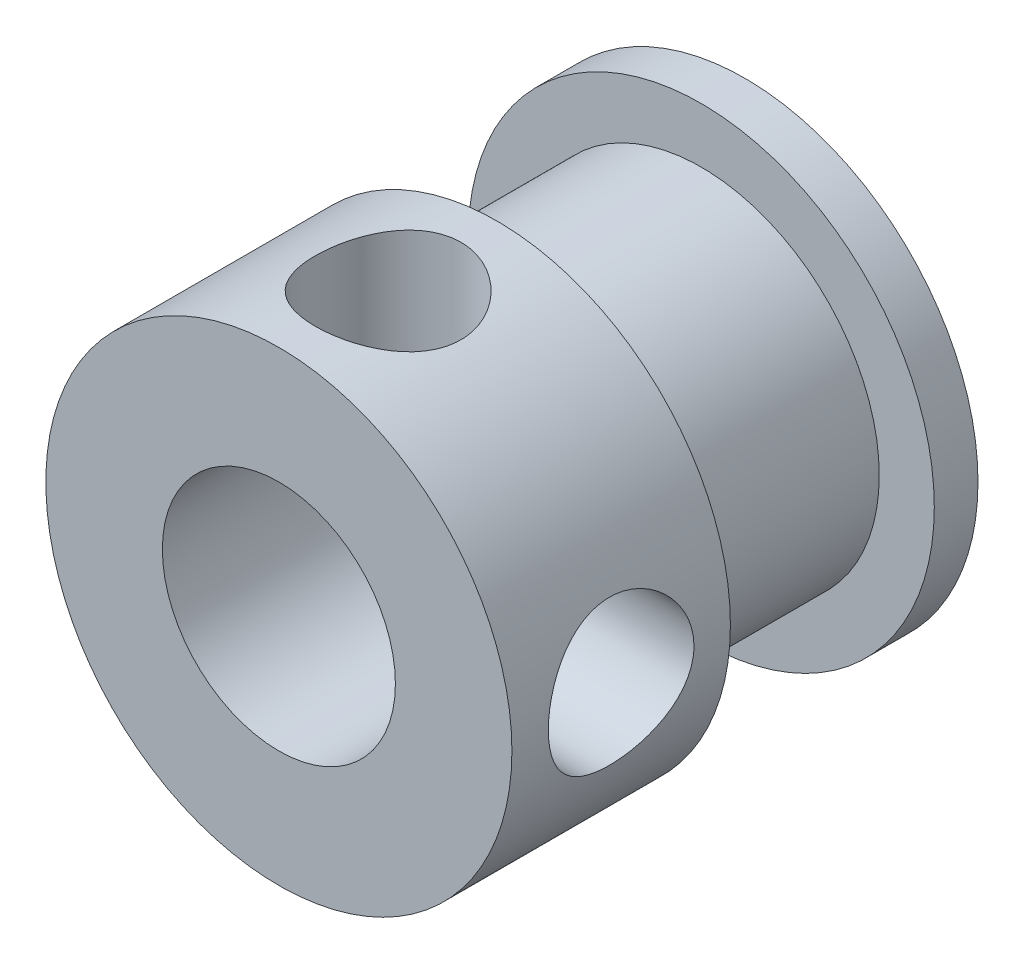
ISO-10303-21;
HEADER;
FILE_DESCRIPTION(('STEP AP214'),'2;1');
FILE_NAME('part.step','',(''),(''),'','','');
FILE_SCHEMA(('AUTOMOTIVE_DESIGN { 1 0 10303 214 1 1 1 1 }'));
ENDSEC;
DATA;
#1=APPLICATION_CONTEXT('core data for automotive mechanical design processes');
#2=APPLICATION_PROTOCOL_DEFINITION('international standard','automotive_design',2000,#1);
#3=PRODUCT_CONTEXT('',#1,'mechanical');
#4=PRODUCT('Part','Part','',(#3));
#5=PRODUCT_RELATED_PRODUCT_CATEGORY('part','',(#4));
#6=PRODUCT_DEFINITION_FORMATION('','',#4);
#7=PRODUCT_DEFINITION_CONTEXT('part definition',#1,'design');
#8=PRODUCT_DEFINITION('design','',#6,#7);
#9=PRODUCT_DEFINITION_SHAPE('','',#8);
#10=(LENGTH_UNIT() NAMED_UNIT(*) SI_UNIT(.MILLI.,.METRE.));
#11=(NAMED_UNIT(*) PLANE_ANGLE_UNIT() SI_UNIT($,.RADIAN.));
#12=(NAMED_UNIT(*) SI_UNIT($,.STERADIAN.) SOLID_ANGLE_UNIT());
#13=UNCERTAINTY_MEASURE_WITH_UNIT(LENGTH_MEASURE(1.E-05),#10,'distance_accuracy_value','');
#14=(GEOMETRIC_REPRESENTATION_CONTEXT(3) GLOBAL_UNCERTAINTY_ASSIGNED_CONTEXT((#13)) GLOBAL_UNIT_ASSIGNED_CONTEXT((#10,
#11,#12)) REPRESENTATION_CONTEXT('',''));
#15=CARTESIAN_POINT('',(0.,0.,0.));
#16=DIRECTION('',(0.,0.,1.));
#17=DIRECTION('',(1.,0.,0.));
#18=AXIS2_PLACEMENT_3D('',#15,#16,#17);
#19=CARTESIAN_POINT('',(0.,0.,1.5));
#20=DIRECTION('',(0.,0.,-1.));
#21=DIRECTION('',(-1.,0.,0.));
#22=AXIS2_PLACEMENT_3D('',#19,#20,#21);
#23=CYLINDRICAL_SURFACE('',#22,8.);
#24=CARTESIAN_POINT('',(0.,0.,1.5));
#25=DIRECTION('',(0.,0.,1.));
#26=DIRECTION('',(1.,0.,0.));
#27=AXIS2_PLACEMENT_3D('',#24,#25,#26);
#28=CIRCLE('',#27,8.);
#29=CARTESIAN_POINT('',(8.,0.,1.5));
#30=VERTEX_POINT('',#29);
#31=EDGE_CURVE('E44',#30,#30,#28,.T.);
#32=ORIENTED_EDGE('',*,*,#31,.F.);
#33=EDGE_LOOP('',(#32));
#34=FACE_BOUND('',#33,.T.);
#35=CARTESIAN_POINT('',(0.,0.,0.));
#36=DIRECTION('',(0.,0.,1.));
#37=DIRECTION('',(1.,0.,0.));
#38=AXIS2_PLACEMENT_3D('',#35,#36,#37);
#39=CIRCLE('',#38,8.);
#40=CARTESIAN_POINT('',(8.,0.,0.));
#41=VERTEX_POINT('',#40);
#42=EDGE_CURVE('E49',#41,#41,#39,.T.);
#43=ORIENTED_EDGE('',*,*,#42,.T.);
#44=EDGE_LOOP('',(#43));
#45=FACE_BOUND('',#44,.T.);
#46=ADVANCED_FACE('F32',(#34,#45),#23,.T.);
#47=CARTESIAN_POINT('',(0.,0.,1.5));
#48=DIRECTION('',(0.,0.,1.));
#49=DIRECTION('',(1.,0.,0.));
#50=AXIS2_PLACEMENT_3D('',#47,#48,#49);
#51=PLANE('',#50);
#52=CARTESIAN_POINT('',(0.,0.,1.5));
#53=DIRECTION('',(0.,0.,1.));
#54=DIRECTION('',(1.,0.,0.));
#55=AXIS2_PLACEMENT_3D('',#52,#53,#54);
#56=CIRCLE('',#55,6.11);
#57=CARTESIAN_POINT('',(6.11,0.,1.5));
#58=VERTEX_POINT('',#57);
#59=EDGE_CURVE('E10',#58,#58,#56,.T.);
#60=ORIENTED_EDGE('',*,*,#59,.F.);
#61=EDGE_LOOP('',(#60));
#62=FACE_BOUND('',#61,.T.);
#63=ORIENTED_EDGE('',*,*,#31,.T.);
#64=EDGE_LOOP('',(#63));
#65=FACE_BOUND('',#64,.T.);
#66=ADVANCED_FACE('F115',(#62,#65),#51,.T.);
#67=CARTESIAN_POINT('',(0.,0.,0.));
#68=DIRECTION('',(0.,0.,1.));
#69=DIRECTION('',(1.,0.,0.));
#70=AXIS2_PLACEMENT_3D('',#67,#68,#69);
#71=PLANE('',#70);
#72=CARTESIAN_POINT('',(0.,0.,0.));
#73=DIRECTION('',(0.,0.,1.));
#74=DIRECTION('',(1.,0.,0.));
#75=AXIS2_PLACEMENT_3D('',#72,#73,#74);
#76=CIRCLE('',#75,4.);
#77=CARTESIAN_POINT('',(4.,0.,0.));
#78=VERTEX_POINT('',#77);
#79=EDGE_CURVE('E90',#78,#78,#76,.F.);
#80=ORIENTED_EDGE('',*,*,#79,.F.);
#81=EDGE_LOOP('',(#80));
#82=FACE_BOUND('',#81,.T.);
#83=ORIENTED_EDGE('',*,*,#42,.F.);
#84=EDGE_LOOP('',(#83));
#85=FACE_BOUND('',#84,.T.);
#86=ADVANCED_FACE('F120',(#82,#85),#71,.F.);
#87=CARTESIAN_POINT('',(0.,0.,8.5));
#88=DIRECTION('',(0.,0.,-1.));
#89=DIRECTION('',(-1.,0.,0.));
#90=AXIS2_PLACEMENT_3D('',#87,#88,#89);
#91=CYLINDRICAL_SURFACE('',#90,6.11);
#92=CARTESIAN_POINT('',(0.,0.,8.5));
#93=DIRECTION('',(0.,0.,1.));
#94=DIRECTION('',(1.,0.,0.));
#95=AXIS2_PLACEMENT_3D('',#92,#93,#94);
#96=CIRCLE('',#95,6.11);
#97=CARTESIAN_POINT('',(6.11,0.,8.5));
#98=VERTEX_POINT('',#97);
#99=EDGE_CURVE('E52',#98,#98,#96,.T.);
#100=ORIENTED_EDGE('',*,*,#99,.F.);
#101=EDGE_LOOP('',(#100));
#102=FACE_BOUND('',#101,.T.);
#103=ORIENTED_EDGE('',*,*,#59,.T.);
#104=EDGE_LOOP('',(#103));
#105=FACE_BOUND('',#104,.T.);
#106=ADVANCED_FACE('F128',(#102,#105),#91,.T.);
#107=CARTESIAN_POINT('',(0.,0.,16.));
#108=DIRECTION('',(0.,0.,-1.));
#109=DIRECTION('',(-1.,0.,0.));
#110=AXIS2_PLACEMENT_3D('',#107,#108,#109);
#111=CYLINDRICAL_SURFACE('',#110,8.);
#112=CARTESIAN_POINT('',(0.,8.,9.75));
#113=CARTESIAN_POINT('',(-0.136878370349093,7.9999993175598,9.75000089317516));
#114=CARTESIAN_POINT('',(-0.273766105005718,7.99645389969682,9.76127845388891));
#115=CARTESIAN_POINT('',(-0.543538419176896,7.98265788177613,9.80597248307847));
#116=CARTESIAN_POINT('',(-0.676422085451814,7.97240576399719,9.83939396272872));
#117=CARTESIAN_POINT('',(-0.934257087301612,7.94631631395819,9.92713874239148));
#118=CARTESIAN_POINT('',(-1.05922035397161,7.9304876299805,9.98142968930593));
#119=CARTESIAN_POINT('',(-1.29826960469292,7.89487938322185,10.1092346353567));
#120=CARTESIAN_POINT('',(-1.41235387088977,7.8750991979981,10.1827516635612));
#121=CARTESIAN_POINT('',(-1.62993066990456,7.83300427480565,10.3493119840347));
#122=CARTESIAN_POINT('',(-1.73304005631332,7.81063431853978,10.4428417701221));
#123=CARTESIAN_POINT('',(-1.92239476407399,7.76620092748417,10.6457367848271));
#124=CARTESIAN_POINT('',(-2.00863694579739,7.74413755046914,10.7551049549891));
#125=CARTESIAN_POINT('',(-2.16388672966227,7.70222289396344,10.9898891276162));
#126=CARTESIAN_POINT('',(-2.23241568300257,7.68243976603591,11.1156349550544));
#127=CARTESIAN_POINT('',(-2.34719482153343,7.64815603598469,11.3775846299637));
#128=CARTESIAN_POINT('',(-2.39345087543889,7.63365404257377,11.5137857115879));
#129=CARTESIAN_POINT('',(-2.46096919860067,7.61215213969002,11.7884561549041));
#130=CARTESIAN_POINT('',(-2.48294220015729,7.60493945859017,11.9267336872777));
#131=CARTESIAN_POINT('',(-2.50349110073976,7.59820110281901,12.2051862378238));
#132=CARTESIAN_POINT('',(-2.50207321991544,7.59867338454669,12.3453607416433));
#133=CARTESIAN_POINT('',(-2.47643649465478,7.60706378150876,12.617748920538));
#134=CARTESIAN_POINT('',(-2.45312115738766,7.61468683491897,12.7500582517231));
#135=CARTESIAN_POINT('',(-2.38581626711252,7.63604051304978,13.0087843130747));
#136=CARTESIAN_POINT('',(-2.34182451689101,7.6497717868623,13.1352004154176));
#137=CARTESIAN_POINT('',(-2.23377749362554,7.68202088028593,13.3807038888653));
#138=CARTESIAN_POINT('',(-2.16943851324163,7.70060569321649,13.499657221384));
#139=CARTESIAN_POINT('',(-2.02272041475696,7.7404371316014,13.7253755357582));
#140=CARTESIAN_POINT('',(-1.94033661043154,7.76168444789102,13.8321373405074));
#141=CARTESIAN_POINT('',(-1.75543390836425,7.80563055600986,14.035549886834));
#142=CARTESIAN_POINT('',(-1.65216914118563,7.82835139211391,14.1315191155594));
#143=CARTESIAN_POINT('',(-1.43072881619106,7.8718314151916,14.3049437871594));
#144=CARTESIAN_POINT('',(-1.31255215469804,7.89259045676745,14.3823978584384));
#145=CARTESIAN_POINT('',(-1.06332922093091,7.93002589780382,14.5170553772025));
#146=CARTESIAN_POINT('',(-0.932189813838559,7.94666921296415,14.5740962709279));
#147=CARTESIAN_POINT('',(-0.661535955565289,7.97375911657108,14.6651060017031));
#148=CARTESIAN_POINT('',(-0.522024061449216,7.98420758650304,14.6990818444768));
#149=CARTESIAN_POINT('',(-0.244370314580689,7.99742778790027,14.741836085158));
#150=CARTESIAN_POINT('',(-0.106383697577686,8.00048045790873,14.751537087187));
#151=CARTESIAN_POINT('',(0.169260611465172,7.99939599461967,14.7480675467253));
#152=CARTESIAN_POINT('',(0.306918348613018,7.9952599116227,14.7349003453548));
#153=CARTESIAN_POINT('',(0.574438665951697,7.98044727539523,14.6868088147872));
#154=CARTESIAN_POINT('',(0.704409956841872,7.96993586221374,14.652433464775));
#155=CARTESIAN_POINT('',(0.956703857722752,7.94360242758579,14.5635712952666));
#156=CARTESIAN_POINT('',(1.07902552089812,7.92777975028687,14.50908199195));
#157=CARTESIAN_POINT('',(1.31586481334437,7.89197085518848,14.3800535669026));
#158=CARTESIAN_POINT('',(1.43011947957558,7.87189253635335,14.3050580250064));
#159=CARTESIAN_POINT('',(1.64473170192052,7.82986820006859,14.1376935797652));
#160=CARTESIAN_POINT('',(1.7450854760879,7.80792167695774,14.0453199645107));
#161=CARTESIAN_POINT('',(1.93317492583804,7.76353989766283,13.8414822198958));
#162=CARTESIAN_POINT('',(2.02025304679062,7.74111973412883,13.7294066725216));
#163=CARTESIAN_POINT('',(2.17442500490303,7.69923894191212,13.4917467672465));
#164=CARTESIAN_POINT('',(2.24151915946859,7.67977826622621,13.366162623946));
#165=CARTESIAN_POINT('',(2.35340166961084,7.64623564661738,13.105309654259));
#166=CARTESIAN_POINT('',(2.39827639112025,7.63213292713749,12.9700807011286));
#167=CARTESIAN_POINT('',(2.4644578863618,7.6110234168862,12.6934550135028));
#168=CARTESIAN_POINT('',(2.48577362827989,7.60401392602456,12.5520606473129));
#169=CARTESIAN_POINT('',(2.50358812316251,7.59816585427753,12.2739918248391));
#170=CARTESIAN_POINT('',(2.50116559243271,7.59897209200283,12.1373930923052));
#171=CARTESIAN_POINT('',(2.47417636257668,7.60780180751807,11.8666508301161));
#172=CARTESIAN_POINT('',(2.44961069645024,7.61582494863208,11.7325071862265));
#173=CARTESIAN_POINT('',(2.37975459827235,7.6379362836678,11.4724119208162));
#174=CARTESIAN_POINT('',(2.33477284812016,7.65193396380514,11.3463691178133));
#175=CARTESIAN_POINT('',(2.22560454669999,7.68439408509128,11.103519172932));
#176=CARTESIAN_POINT('',(2.16141408888473,7.70285743429343,10.9867139158432));
#177=CARTESIAN_POINT('',(2.01271350026986,7.74306974067005,10.7607080591204));
#178=CARTESIAN_POINT('',(1.92750667048264,7.76491897845914,10.6519837409995));
#179=CARTESIAN_POINT('',(1.7404179928096,7.8089799764242,10.450027343776));
#180=CARTESIAN_POINT('',(1.63853168468878,7.83119183213309,10.3567994220179));
#181=CARTESIAN_POINT('',(1.41697332564669,7.87434543904947,10.1854349232741));
#182=CARTESIAN_POINT('',(1.29682914897477,7.89522203461345,10.1078905271001));
#183=CARTESIAN_POINT('',(1.0445582760273,7.93253538593756,9.97420216972109));
#184=CARTESIAN_POINT('',(0.912436315590897,7.94897388631644,9.91804979571633));
#185=CARTESIAN_POINT('',(0.651495270747957,7.97441301466941,9.83281726478307));
#186=CARTESIAN_POINT('',(0.523340674225093,7.98392481612283,9.80185026538933));
#187=CARTESIAN_POINT('',(0.263459790880496,7.99671800680967,9.76044328006457));
#188=CARTESIAN_POINT('',(0.13173423227935,8.00000065679286,9.749999140392));
#189=CARTESIAN_POINT('',(0.,8.,9.75));
#190=B_SPLINE_CURVE_WITH_KNOTS('',3,(#112,#113,#114,#115,#116,#117,#118,#119,#120,#121,#122,
#123,#124,#125,#126,#127,#128,#129,#130,#131,#132,#133,#134,#135,#136,#137,#138,#139,#140,#141,
#142,#143,#144,#145,#146,#147,#148,#149,#150,#151,#152,#153,#154,#155,#156,#157,#158,#159,#160,
#161,#162,#163,#164,#165,#166,#167,#168,#169,#170,#171,#172,#173,#174,#175,#176,#177,#178,#179,
#180,#181,#182,#183,#184,#185,#186,#187,#188,#189),.UNSPECIFIED.,.T.,.F.,(4,2,2,2,2,2,2,2,2,2,2,
2,2,2,2,2,2,2,2,2,2,2,2,2,2,2,2,2,2,2,2,2,2,2,2,2,2,2,4),(0.,0.410150898865019,
0.820394646698132,1.23000495840487,1.63967984311678,2.06075644390316,2.48191134862552,
2.91347542494988,3.34492572559054,3.7633830033442,4.18172900590276,4.58353834844338,
4.98539039958125,5.3931128544109,5.80094132020717,6.227334945592,6.65376014826606,
7.0835092137954,7.51312768989108,7.92615137096475,8.33911471298725,8.74181253445744,
9.14456010068999,9.55712649476686,9.96980491418518,10.3988355742628,10.8278594196742,
11.2552023150671,11.6823824779468,12.0902440696666,12.4980866352126,12.8999582681244,
13.3019116867944,13.7195902803182,14.1373807476578,14.5688133627192,15.0000761335177,
15.3948927332218,15.7896294154519),.UNSPECIFIED.);
#191=CARTESIAN_POINT('',(0.,8.,9.75));
#192=VERTEX_POINT('',#191);
#193=EDGE_CURVE('E84',#192,#192,#190,.T.);
#194=ORIENTED_EDGE('',*,*,#193,.F.);
#195=EDGE_LOOP('',(#194));
#196=FACE_BOUND('',#195,.T.);
#197=CARTESIAN_POINT('',(8.,0.,14.75));
#198=CARTESIAN_POINT('',(7.9999993175598,-0.136878370349093,14.7499991068248));
#199=CARTESIAN_POINT('',(7.99645389969682,-0.273766105005718,14.7387215461111));
#200=CARTESIAN_POINT('',(7.98265788177613,-0.543538419176896,14.6940275169215));
#201=CARTESIAN_POINT('',(7.97240576399719,-0.676422085451814,14.6606060372713));
#202=CARTESIAN_POINT('',(7.94631631395819,-0.934257087301612,14.5728612576085));
#203=CARTESIAN_POINT('',(7.9304876299805,-1.05922035397161,14.5185703106941));
#204=CARTESIAN_POINT('',(7.89487938322185,-1.29826960469292,14.3907653646433));
#205=CARTESIAN_POINT('',(7.8750991979981,-1.41235387088977,14.3172483364388));
#206=CARTESIAN_POINT('',(7.83300427480565,-1.62993066990456,14.1506880159653));
#207=CARTESIAN_POINT('',(7.81063431853978,-1.73304005631332,14.0571582298779));
#208=CARTESIAN_POINT('',(7.76620092748417,-1.92239476407399,13.8542632151729));
#209=CARTESIAN_POINT('',(7.74413755046914,-2.00863694579739,13.7448950450109));
#210=CARTESIAN_POINT('',(7.70222289396344,-2.16388672966227,13.5101108723838));
#211=CARTESIAN_POINT('',(7.68243976603591,-2.23241568300257,13.3843650449456));
#212=CARTESIAN_POINT('',(7.64815603598469,-2.34719482153343,13.1224153700363));
#213=CARTESIAN_POINT('',(7.63365404257377,-2.39345087543889,12.9862142884121));
#214=CARTESIAN_POINT('',(7.61215213969002,-2.46096919860067,12.7115438450959));
#215=CARTESIAN_POINT('',(7.60493945859017,-2.48294220015729,12.5732663127223));
#216=CARTESIAN_POINT('',(7.59820110281901,-2.50349110073976,12.2948137621762));
#217=CARTESIAN_POINT('',(7.59867338454669,-2.50207321991544,12.1546392583567));
#218=CARTESIAN_POINT('',(7.60706378150876,-2.47643649465478,11.882251079462));
#219=CARTESIAN_POINT('',(7.61468683491897,-2.45312115738766,11.7499417482769));
#220=CARTESIAN_POINT('',(7.63604051304978,-2.38581626711252,11.4912156869253));
#221=CARTESIAN_POINT('',(7.6497717868623,-2.34182451689101,11.3647995845824));
#222=CARTESIAN_POINT('',(7.68202088028593,-2.23377749362554,11.1192961111347));
#223=CARTESIAN_POINT('',(7.70060569321649,-2.16943851324163,11.000342778616));
#224=CARTESIAN_POINT('',(7.7404371316014,-2.02272041475696,10.7746244642418));
#225=CARTESIAN_POINT('',(7.76168444789102,-1.94033661043154,10.6678626594926));
#226=CARTESIAN_POINT('',(7.80563055600986,-1.75543390836425,10.464450113166));
#227=CARTESIAN_POINT('',(7.82835139211391,-1.65216914118563,10.3684808844406));
#228=CARTESIAN_POINT('',(7.8718314151916,-1.43072881619106,10.1950562128406));
#229=CARTESIAN_POINT('',(7.89259045676745,-1.31255215469804,10.1176021415616));
#230=CARTESIAN_POINT('',(7.93002589780382,-1.06332922093091,9.98294462279745));
#231=CARTESIAN_POINT('',(7.94666921296415,-0.932189813838559,9.92590372907206));
#232=CARTESIAN_POINT('',(7.97375911657108,-0.661535955565288,9.83489399829687));
#233=CARTESIAN_POINT('',(7.98420758650304,-0.522024061449216,9.80091815552321));
#234=CARTESIAN_POINT('',(7.99742778790027,-0.244370314580689,9.75816391484204));
#235=CARTESIAN_POINT('',(8.00048045790873,-0.106383697577686,9.74846291281295));
#236=CARTESIAN_POINT('',(7.99939599461967,0.169260611465172,9.75193245327466));
#237=CARTESIAN_POINT('',(7.9952599116227,0.306918348613018,9.76509965464522));
#238=CARTESIAN_POINT('',(7.98044727539523,0.574438665951697,9.81319118521277));
#239=CARTESIAN_POINT('',(7.96993586221374,0.704409956841873,9.84756653522498));
#240=CARTESIAN_POINT('',(7.94360242758579,0.956703857722753,9.93642870473343));
#241=CARTESIAN_POINT('',(7.92777975028687,1.07902552089812,9.99091800805003));
#242=CARTESIAN_POINT('',(7.89197085518848,1.31586481334438,10.1199464330974));
#243=CARTESIAN_POINT('',(7.87189253635335,1.43011947957558,10.1949419749936));
#244=CARTESIAN_POINT('',(7.82986820006859,1.64473170192052,10.3623064202348));
#245=CARTESIAN_POINT('',(7.80792167695774,1.7450854760879,10.4546800354893));
#246=CARTESIAN_POINT('',(7.76353989766283,1.93317492583804,10.6585177801042));
#247=CARTESIAN_POINT('',(7.74111973412883,2.02025304679062,10.7705933274784));
#248=CARTESIAN_POINT('',(7.69923894191212,2.17442500490303,11.0082532327535));
#249=CARTESIAN_POINT('',(7.67977826622621,2.24151915946859,11.133837376054));
#250=CARTESIAN_POINT('',(7.64623564661738,2.35340166961084,11.394690345741));
#251=CARTESIAN_POINT('',(7.63213292713749,2.39827639112025,11.5299192988714));
#252=CARTESIAN_POINT('',(7.6110234168862,2.4644578863618,11.8065449864972));
#253=CARTESIAN_POINT('',(7.60401392602456,2.48577362827989,11.9479393526871));
#254=CARTESIAN_POINT('',(7.59816585427753,2.50358812316251,12.2260081751609));
#255=CARTESIAN_POINT('',(7.59897209200284,2.50116559243271,12.3626069076948));
#256=CARTESIAN_POINT('',(7.60780180751807,2.47417636257667,12.6333491698839));
#257=CARTESIAN_POINT('',(7.61582494863208,2.44961069645024,12.7674928137735));
#258=CARTESIAN_POINT('',(7.6379362836678,2.37975459827235,13.0275880791838));
#259=CARTESIAN_POINT('',(7.65193396380513,2.33477284812016,13.1536308821867));
#260=CARTESIAN_POINT('',(7.68439408509128,2.22560454669999,13.396480827068));
#261=CARTESIAN_POINT('',(7.70285743429343,2.16141408888473,13.5132860841568));
#262=CARTESIAN_POINT('',(7.74306974067005,2.01271350026986,13.7392919408796));
#263=CARTESIAN_POINT('',(7.76491897845914,1.92750667048264,13.8480162590005));
#264=CARTESIAN_POINT('',(7.8089799764242,1.7404179928096,14.049972656224));
#265=CARTESIAN_POINT('',(7.83119183213309,1.63853168468878,14.1432005779821));
#266=CARTESIAN_POINT('',(7.87434543904947,1.41697332564669,14.3145650767259));
#267=CARTESIAN_POINT('',(7.89522203461345,1.29682914897477,14.3921094728999));
#268=CARTESIAN_POINT('',(7.93253538593756,1.0445582760273,14.5257978302789));
#269=CARTESIAN_POINT('',(7.94897388631644,0.912436315590897,14.5819502042837));
#270=CARTESIAN_POINT('',(7.97441301466941,0.651495270747957,14.6671827352169));
#271=CARTESIAN_POINT('',(7.98392481612283,0.523340674225092,14.6981497346107));
#272=CARTESIAN_POINT('',(7.99671800680967,0.263459790880495,14.7395567199354));
#273=CARTESIAN_POINT('',(8.00000065679286,0.13173423227935,14.750000859608));
#274=CARTESIAN_POINT('',(8.,0.,14.75));
#275=B_SPLINE_CURVE_WITH_KNOTS('',3,(#197,#198,#199,#200,#201,#202,#203,#204,#205,#206,#207,
#208,#209,#210,#211,#212,#213,#214,#215,#216,#217,#218,#219,#220,#221,#222,#223,#224,#225,#226,
#227,#228,#229,#230,#231,#232,#233,#234,#235,#236,#237,#238,#239,#240,#241,#242,#243,#244,#245,
#246,#247,#248,#249,#250,#251,#252,#253,#254,#255,#256,#257,#258,#259,#260,#261,#262,#263,#264,
#265,#266,#267,#268,#269,#270,#271,#272,#273,#274),.UNSPECIFIED.,.T.,.F.,(4,2,2,2,2,2,2,2,2,2,2,
2,2,2,2,2,2,2,2,2,2,2,2,2,2,2,2,2,2,2,2,2,2,2,2,2,2,2,4),(0.,0.410150898865019,
0.820394646698132,1.23000495840487,1.63967984311678,2.06075644390316,2.48191134862552,
2.91347542494988,3.34492572559054,3.7633830033442,4.18172900590276,4.58353834844338,
4.98539039958125,5.3931128544109,5.80094132020717,6.227334945592,6.65376014826606,
7.0835092137954,7.51312768989108,7.92615137096475,8.33911471298725,8.74181253445744,
9.14456010068999,9.55712649476686,9.96980491418518,10.3988355742628,10.8278594196742,
11.2552023150671,11.6823824779468,12.0902440696666,12.4980866352126,12.8999582681244,
13.3019116867944,13.7195902803182,14.1373807476578,14.5688133627192,15.0000761335177,
15.3948927332218,15.7896294154519),.UNSPECIFIED.);
#276=CARTESIAN_POINT('',(8.,0.,14.75));
#277=VERTEX_POINT('',#276);
#278=EDGE_CURVE('E63',#277,#277,#275,.T.);
#279=ORIENTED_EDGE('',*,*,#278,.F.);
#280=EDGE_LOOP('',(#279));
#281=FACE_BOUND('',#280,.T.);
#282=CARTESIAN_POINT('',(0.,0.,16.));
#283=DIRECTION('',(0.,0.,1.));
#284=DIRECTION('',(1.,0.,0.));
#285=AXIS2_PLACEMENT_3D('',#282,#283,#284);
#286=CIRCLE('',#285,8.);
#287=CARTESIAN_POINT('',(8.,0.,16.));
#288=VERTEX_POINT('',#287);
#289=EDGE_CURVE('E94',#288,#288,#286,.T.);
#290=ORIENTED_EDGE('',*,*,#289,.F.);
#291=EDGE_LOOP('',(#290));
#292=FACE_BOUND('',#291,.T.);
#293=CARTESIAN_POINT('',(0.,0.,8.5));
#294=DIRECTION('',(0.,0.,1.));
#295=DIRECTION('',(1.,0.,0.));
#296=AXIS2_PLACEMENT_3D('',#293,#294,#295);
#297=CIRCLE('',#296,8.);
#298=CARTESIAN_POINT('',(8.,0.,8.5));
#299=VERTEX_POINT('',#298);
#300=EDGE_CURVE('E93',#299,#299,#297,.T.);
#301=ORIENTED_EDGE('',*,*,#300,.T.);
#302=EDGE_LOOP('',(#301));
#303=FACE_BOUND('',#302,.T.);
#304=ADVANCED_FACE('F99',(#196,#281,#292,#303),#111,.T.);
#305=CARTESIAN_POINT('',(0.,0.,16.));
#306=DIRECTION('',(0.,0.,1.));
#307=DIRECTION('',(1.,0.,0.));
#308=AXIS2_PLACEMENT_3D('',#305,#306,#307);
#309=PLANE('',#308);
#310=CARTESIAN_POINT('',(0.,0.,16.));
#311=DIRECTION('',(0.,0.,1.));
#312=DIRECTION('',(1.,0.,0.));
#313=AXIS2_PLACEMENT_3D('',#310,#311,#312);
#314=CIRCLE('',#313,4.);
#315=CARTESIAN_POINT('',(4.,0.,16.));
#316=VERTEX_POINT('',#315);
#317=EDGE_CURVE('E62',#316,#316,#314,.T.);
#318=ORIENTED_EDGE('',*,*,#317,.F.);
#319=EDGE_LOOP('',(#318));
#320=FACE_BOUND('',#319,.T.);
#321=ORIENTED_EDGE('',*,*,#289,.T.);
#322=EDGE_LOOP('',(#321));
#323=FACE_BOUND('',#322,.T.);
#324=ADVANCED_FACE('F103',(#320,#323),#309,.T.);
#325=CARTESIAN_POINT('',(0.,0.,8.5));
#326=DIRECTION('',(0.,0.,1.));
#327=DIRECTION('',(1.,0.,0.));
#328=AXIS2_PLACEMENT_3D('',#325,#326,#327);
#329=PLANE('',#328);
#330=ORIENTED_EDGE('',*,*,#99,.T.);
#331=EDGE_LOOP('',(#330));
#332=FACE_BOUND('',#331,.T.);
#333=ORIENTED_EDGE('',*,*,#300,.F.);
#334=EDGE_LOOP('',(#333));
#335=FACE_BOUND('',#334,.T.);
#336=ADVANCED_FACE('F101',(#332,#335),#329,.F.);
#337=CARTESIAN_POINT('',(0.,0.,-11.3137084989848));
#338=DIRECTION('',(0.,0.,1.));
#339=DIRECTION('',(1.,0.,0.));
#340=AXIS2_PLACEMENT_3D('',#337,#338,#339);
#341=CYLINDRICAL_SURFACE('',#340,4.);
#342=CARTESIAN_POINT('',(0.,4.,9.75));
#343=CARTESIAN_POINT('',(-0.127017476559871,3.99999041333571,9.75001047614361));
#344=CARTESIAN_POINT('',(-0.254191951791703,3.9938860659399,9.75974649990168));
#345=CARTESIAN_POINT('',(-0.504637456621344,3.97004375552586,9.79817112968427));
#346=CARTESIAN_POINT('',(-0.627900575825985,3.95228361873137,9.82689586026121));
#347=CARTESIAN_POINT('',(-0.866410868269161,3.90691695293563,9.90162285328754));
#348=CARTESIAN_POINT('',(-0.981694420709429,3.87935918690877,9.94753960978757));
#349=CARTESIAN_POINT('',(-1.20252080434994,3.81669199838277,10.0547716674915));
#350=CARTESIAN_POINT('',(-1.30806471304098,3.7815834126609,10.1160852625531));
#351=CARTESIAN_POINT('',(-1.51594836437078,3.70340304945467,10.2577731565911));
#352=CARTESIAN_POINT('',(-1.61735911616791,3.65991924217889,10.3392786027018));
#353=CARTESIAN_POINT('',(-1.80597275567284,3.57062700058922,10.5164383462585));
#354=CARTESIAN_POINT('',(-1.89315621594404,3.52481549782957,10.6121116557389));
#355=CARTESIAN_POINT('',(-2.06285746302521,3.42860837235627,10.8300677892912));
#356=CARTESIAN_POINT('',(-2.14314412018317,3.37843221966147,10.9541995734309));
#357=CARTESIAN_POINT('',(-2.28147932079995,3.28660396278105,11.2171296306783));
#358=CARTESIAN_POINT('',(-2.33956541787438,3.2449375200046,11.355902625168));
#359=CARTESIAN_POINT('',(-2.41866801180576,3.18619151248815,11.6076210475457));
#360=CARTESIAN_POINT('',(-2.44539104794679,3.16553811970886,11.7179336369183));
#361=CARTESIAN_POINT('',(-2.4836368711914,3.1356271466086,11.9426118513807));
#362=CARTESIAN_POINT('',(-2.49518112485637,3.12635347378457,12.0569715171732));
#363=CARTESIAN_POINT('',(-2.50237836690497,3.12059771534501,12.2868260328764));
#364=CARTESIAN_POINT('',(-2.49798968200884,3.12414917427958,12.402323070578));
#365=CARTESIAN_POINT('',(-2.47352633347829,3.14354804883411,12.6306202087266));
#366=CARTESIAN_POINT('',(-2.45343909745149,3.15940531965489,12.7434180728499));
#367=CARTESIAN_POINT('',(-2.3993620946426,3.20065145822146,12.9608768967436));
#368=CARTESIAN_POINT('',(-2.36570043522604,3.22581428653571,13.0656648797174));
#369=CARTESIAN_POINT('',(-2.28580369589507,3.28291134443418,13.2683223964732));
#370=CARTESIAN_POINT('',(-2.2395641689404,3.31484796808523,13.3661894678435));
#371=CARTESIAN_POINT('',(-2.12589830407261,3.38909625095658,13.5716664075102));
#372=CARTESIAN_POINT('',(-2.05612773657746,3.4322315520855,13.6776810518524));
#373=CARTESIAN_POINT('',(-1.90176111958637,3.52011451554715,13.8776611269764));
#374=CARTESIAN_POINT('',(-1.81714983251341,3.56486379714022,13.9716140000451));
#375=CARTESIAN_POINT('',(-1.61904732877734,3.65959667460597,14.1606010095826));
#376=CARTESIAN_POINT('',(-1.50309447420017,3.70922571443728,14.2532559427216));
#377=CARTESIAN_POINT('',(-1.25426444468514,3.8005660184067,14.417711793631));
#378=CARTESIAN_POINT('',(-1.12139395127005,3.84228039228673,14.4895209078095));
#379=CARTESIAN_POINT('',(-0.915775751567443,3.89435975869902,14.577345956635));
#380=CARTESIAN_POINT('',(-0.848193583187394,3.90966874385268,14.6028342864304));
#381=CARTESIAN_POINT('',(-0.710492049478447,3.93701839875445,14.6480076504786));
#382=CARTESIAN_POINT('',(-0.6403741759679,3.94906095588034,14.6676960365708));
#383=CARTESIAN_POINT('',(-0.498239019538474,3.96949699527849,14.7009341616424));
#384=CARTESIAN_POINT('',(-0.426223500915278,3.97789374843884,14.714489403526));
#385=CARTESIAN_POINT('',(-0.280965673560735,3.99078766491331,14.7352462933136));
#386=CARTESIAN_POINT('',(-0.207723576570754,3.99528549435853,14.7424490265473));
#387=CARTESIAN_POINT('',(-0.00911917689680824,4.00193773474167,14.7531093046435));
#388=CARTESIAN_POINT('',(0.116782016705692,4.000238122366,14.7504003631235));
#389=CARTESIAN_POINT('',(0.365967766011664,3.98518313408306,14.7262403355346));
#390=CARTESIAN_POINT('',(0.489252499359947,3.97182855210102,14.7047905260753));
#391=CARTESIAN_POINT('',(0.725036194002598,3.93547975555369,14.6455214120172));
#392=CARTESIAN_POINT('',(0.837768421062909,3.91288306371127,14.6083752792302));
#393=CARTESIAN_POINT('',(1.05527816125331,3.85991402897874,14.5194076286876));
#394=CARTESIAN_POINT('',(1.16005433861599,3.82954038411642,14.4675836534986));
#395=CARTESIAN_POINT('',(1.37016761969194,3.75980014020658,14.3449694624922));
#396=CARTESIAN_POINT('',(1.47449380296905,3.71983526755373,14.272792827725));
#397=CARTESIAN_POINT('',(1.67028541330073,3.63613942885727,14.1144123035307));
#398=CARTESIAN_POINT('',(1.76173634038025,3.59240430473134,14.0281928311143));
#399=CARTESIAN_POINT('',(1.94294835276253,3.49811738486729,13.8297299101543));
#400=CARTESIAN_POINT('',(2.03053702733637,3.44749766579192,13.7155255845025));
#401=CARTESIAN_POINT('',(2.18560704916439,3.35133525746893,13.4722484330174));
#402=CARTESIAN_POINT('',(2.25310231693768,3.3057890670837,13.3431859871087));
#403=CARTESIAN_POINT('',(2.35369543821018,3.2346706057884,13.1006157034004));
#404=CARTESIAN_POINT('',(2.39103791720685,3.20691272363805,12.9895184986113));
#405=CARTESIAN_POINT('',(2.45000216420747,3.16210061351252,12.7612137083866));
#406=CARTESIAN_POINT('',(2.47164849805251,3.1450296652982,12.6440159803106));
#407=CARTESIAN_POINT('',(2.49802767469226,3.124126499326,12.4058194470296));
#408=CARTESIAN_POINT('',(2.50266374586469,3.12037003193165,12.2848028321201));
#409=CARTESIAN_POINT('',(2.49439556773531,3.12698126375719,12.0437380761705));
#410=CARTESIAN_POINT('',(2.48148548821457,3.1373536577048,11.9236902703806));
#411=CARTESIAN_POINT('',(2.44076547086104,3.16910777009989,11.6979404205639));
#412=CARTESIAN_POINT('',(2.41423847191721,3.18953614189074,11.5918614354976));
#413=CARTESIAN_POINT('',(2.34835238743426,3.23835062785226,11.3857298424817));
#414=CARTESIAN_POINT('',(2.30898795090781,3.26674005971309,11.2856797681827));
#415=CARTESIAN_POINT('',(2.21205415803959,3.33327797617852,11.0788066756619));
#416=CARTESIAN_POINT('',(2.15267427981667,3.3722442852408,10.9731000537363));
#417=CARTESIAN_POINT('',(2.01999894889208,3.45335445323995,10.7721226142907));
#418=CARTESIAN_POINT('',(1.94669224594686,3.49550086438999,10.6768603326259));
#419=CARTESIAN_POINT('',(1.77134669685941,3.58803675426846,10.4799744162016));
#420=CARTESIAN_POINT('',(1.66649284489893,3.63840488260278,10.3808302384607));
#421=CARTESIAN_POINT('',(1.43961937990849,3.7339805383823,10.2009984038749));
#422=CARTESIAN_POINT('',(1.3175892119665,3.77918486147258,10.1203221763225));
#423=CARTESIAN_POINT('',(1.12346357942551,3.83959214728415,10.0154365614412));
#424=CARTESIAN_POINT('',(1.05679601158095,3.85851834157057,9.98312519995301));
#425=CARTESIAN_POINT('',(0.920199584374066,3.89335165397882,9.92432774817621));
#426=CARTESIAN_POINT('',(0.850272633931988,3.9092605122592,9.89783829886491));
#427=CARTESIAN_POINT('',(0.70787368843777,3.93753374175517,9.85114285553784));
#428=CARTESIAN_POINT('',(0.635409144572268,3.94990764965183,9.83091994275434));
#429=CARTESIAN_POINT('',(0.488456989557118,3.97075677458059,9.79702454441763));
#430=CARTESIAN_POINT('',(0.413970913545531,3.97923486692924,9.78334722756053));
#431=CARTESIAN_POINT('',(0.282852605094052,3.99038271291772,9.76540958977327));
#432=CARTESIAN_POINT('',(0.226501515914869,3.99398159517595,9.75963846974782));
#433=CARTESIAN_POINT('',(0.113444074519046,3.99879245372932,9.75193121637285));
#434=CARTESIAN_POINT('',(0.0567377005313052,4.00000428228699,9.74999532038964));
#435=CARTESIAN_POINT('',(0.,4.,9.75));
#436=B_SPLINE_CURVE_WITH_KNOTS('',3,(#342,#343,#344,#345,#346,#347,#348,#349,#350,#351,#352,
#353,#354,#355,#356,#357,#358,#359,#360,#361,#362,#363,#364,#365,#366,#367,#368,#369,#370,#371,
#372,#373,#374,#375,#376,#377,#378,#379,#380,#381,#382,#383,#384,#385,#386,#387,#388,#389,#390,
#391,#392,#393,#394,#395,#396,#397,#398,#399,#400,#401,#402,#403,#404,#405,#406,#407,#408,#409,
#410,#411,#412,#413,#414,#415,#416,#417,#418,#419,#420,#421,#422,#423,#424,#425,#426,#427,#428,
#429,#430,#431,#432,#433,#434,#435),.UNSPECIFIED.,.T.,.F.,(4,2,2,2,2,2,2,2,2,2,2,2,2,2,2,2,2,2,
2,2,2,2,2,2,2,2,2,2,2,2,2,2,2,2,2,2,2,2,2,2,2,2,2,2,2,2,4),(0.,0.380824602868265,
0.762375788256923,1.14205397519027,1.52169010807759,1.93164374107244,2.34215256651403,
2.80825951705946,3.27357449214021,3.61824017759434,3.96241789414781,4.30749646997556,
4.65285169010166,4.99031678920873,5.32790135816066,5.72854900708719,6.12961045150363,
6.59684361399043,7.06389281455722,7.28510978359955,7.50619865744382,7.72708876613707,
7.94794112831293,8.32363778110177,8.69930884379593,9.06028425977628,9.42132014771964,
9.81879878896136,10.216721545704,10.6724083464246,11.1277787130885,11.4876929754247,
11.8470427174174,12.2084336629143,12.5699447204276,12.9023575499051,13.2349091154192,
13.6156046298899,13.9966089922257,14.4531049498525,14.9098826607203,15.138984863948,
15.3679545348469,15.5963005225022,15.8244777070605,15.994578512822,16.1646898459841),.UNSPECIFIED.);
#437=CARTESIAN_POINT('',(0.,4.,9.75));
#438=VERTEX_POINT('',#437);
#439=EDGE_CURVE('E35',#438,#438,#436,.T.);
#440=ORIENTED_EDGE('',*,*,#439,.T.);
#441=EDGE_LOOP('',(#440));
#442=FACE_BOUND('',#441,.T.);
#443=CARTESIAN_POINT('',(4.,0.,9.75));
#444=CARTESIAN_POINT('',(3.99999041333571,0.127017476559871,9.75001047614361));
#445=CARTESIAN_POINT('',(3.9938860659399,0.254191951791703,9.75974649990168));
#446=CARTESIAN_POINT('',(3.97004375552586,0.504637456621344,9.79817112968427));
#447=CARTESIAN_POINT('',(3.95228361873137,0.627900575825985,9.82689586026121));
#448=CARTESIAN_POINT('',(3.90691695293563,0.866410868269161,9.90162285328754));
#449=CARTESIAN_POINT('',(3.87935918690877,0.981694420709429,9.94753960978757));
#450=CARTESIAN_POINT('',(3.81669199838277,1.20252080434994,10.0547716674915));
#451=CARTESIAN_POINT('',(3.7815834126609,1.30806471304098,10.1160852625531));
#452=CARTESIAN_POINT('',(3.70340304945467,1.51594836437078,10.2577731565911));
#453=CARTESIAN_POINT('',(3.65991924217889,1.61735911616791,10.3392786027018));
#454=CARTESIAN_POINT('',(3.57062700058922,1.80597275567284,10.5164383462585));
#455=CARTESIAN_POINT('',(3.52481549782957,1.89315621594404,10.6121116557389));
#456=CARTESIAN_POINT('',(3.42860837235627,2.06285746302521,10.8300677892912));
#457=CARTESIAN_POINT('',(3.37843221966147,2.14314412018317,10.9541995734309));
#458=CARTESIAN_POINT('',(3.28660396278105,2.28147932079995,11.2171296306783));
#459=CARTESIAN_POINT('',(3.2449375200046,2.33956541787438,11.355902625168));
#460=CARTESIAN_POINT('',(3.18619151248815,2.41866801180576,11.6076210475457));
#461=CARTESIAN_POINT('',(3.16553811970886,2.44539104794679,11.7179336369183));
#462=CARTESIAN_POINT('',(3.1356271466086,2.4836368711914,11.9426118513807));
#463=CARTESIAN_POINT('',(3.12635347378457,2.49518112485637,12.0569715171732));
#464=CARTESIAN_POINT('',(3.12059771534501,2.50237836690497,12.2868260328764));
#465=CARTESIAN_POINT('',(3.12414917427958,2.49798968200884,12.402323070578));
#466=CARTESIAN_POINT('',(3.14354804883411,2.47352633347829,12.6306202087266));
#467=CARTESIAN_POINT('',(3.15940531965489,2.45343909745149,12.7434180728499));
#468=CARTESIAN_POINT('',(3.20065145822146,2.3993620946426,12.9608768967436));
#469=CARTESIAN_POINT('',(3.22581428653571,2.36570043522604,13.0656648797174));
#470=CARTESIAN_POINT('',(3.28291134443418,2.28580369589507,13.2683223964732));
#471=CARTESIAN_POINT('',(3.31484796808523,2.2395641689404,13.3661894678435));
#472=CARTESIAN_POINT('',(3.38909625095658,2.12589830407261,13.5716664075102));
#473=CARTESIAN_POINT('',(3.4322315520855,2.05612773657746,13.6776810518524));
#474=CARTESIAN_POINT('',(3.52011451554715,1.90176111958637,13.8776611269764));
#475=CARTESIAN_POINT('',(3.56486379714022,1.81714983251341,13.9716140000451));
#476=CARTESIAN_POINT('',(3.65959667460597,1.61904732877734,14.1606010095826));
#477=CARTESIAN_POINT('',(3.70922571443728,1.50309447420017,14.2532559427216));
#478=CARTESIAN_POINT('',(3.8005660184067,1.25426444468514,14.417711793631));
#479=CARTESIAN_POINT('',(3.84228039228673,1.12139395127005,14.4895209078095));
#480=CARTESIAN_POINT('',(3.89435975869902,0.915775751567443,14.577345956635));
#481=CARTESIAN_POINT('',(3.90966874385268,0.848193583187394,14.6028342864304));
#482=CARTESIAN_POINT('',(3.93701839875445,0.710492049478447,14.6480076504786));
#483=CARTESIAN_POINT('',(3.94906095588034,0.6403741759679,14.6676960365708));
#484=CARTESIAN_POINT('',(3.96949699527849,0.498239019538474,14.7009341616424));
#485=CARTESIAN_POINT('',(3.97789374843884,0.426223500915278,14.714489403526));
#486=CARTESIAN_POINT('',(3.99078766491331,0.280965673560735,14.7352462933136));
#487=CARTESIAN_POINT('',(3.99528549435853,0.207723576570754,14.7424490265473));
#488=CARTESIAN_POINT('',(4.00193773474167,0.00911917689680824,14.7531093046435));
#489=CARTESIAN_POINT('',(4.000238122366,-0.116782016705692,14.7504003631235));
#490=CARTESIAN_POINT('',(3.98518313408306,-0.365967766011664,14.7262403355346));
#491=CARTESIAN_POINT('',(3.97182855210102,-0.489252499359947,14.7047905260753));
#492=CARTESIAN_POINT('',(3.93547975555369,-0.725036194002598,14.6455214120172));
#493=CARTESIAN_POINT('',(3.91288306371127,-0.837768421062909,14.6083752792302));
#494=CARTESIAN_POINT('',(3.85991402897874,-1.05527816125331,14.5194076286876));
#495=CARTESIAN_POINT('',(3.82954038411642,-1.16005433861599,14.4675836534986));
#496=CARTESIAN_POINT('',(3.75980014020658,-1.37016761969194,14.3449694624922));
#497=CARTESIAN_POINT('',(3.71983526755373,-1.47449380296905,14.272792827725));
#498=CARTESIAN_POINT('',(3.63613942885727,-1.67028541330073,14.1144123035307));
#499=CARTESIAN_POINT('',(3.59240430473134,-1.76173634038025,14.0281928311143));
#500=CARTESIAN_POINT('',(3.49811738486729,-1.94294835276253,13.8297299101543));
#501=CARTESIAN_POINT('',(3.44749766579192,-2.03053702733637,13.7155255845025));
#502=CARTESIAN_POINT('',(3.35133525746893,-2.18560704916439,13.4722484330174));
#503=CARTESIAN_POINT('',(3.3057890670837,-2.25310231693768,13.3431859871087));
#504=CARTESIAN_POINT('',(3.2346706057884,-2.35369543821018,13.1006157034004));
#505=CARTESIAN_POINT('',(3.20691272363805,-2.39103791720685,12.9895184986113));
#506=CARTESIAN_POINT('',(3.16210061351252,-2.45000216420747,12.7612137083866));
#507=CARTESIAN_POINT('',(3.1450296652982,-2.47164849805251,12.6440159803106));
#508=CARTESIAN_POINT('',(3.124126499326,-2.49802767469226,12.4058194470296));
#509=CARTESIAN_POINT('',(3.12037003193165,-2.50266374586469,12.2848028321201));
#510=CARTESIAN_POINT('',(3.12698126375719,-2.49439556773531,12.0437380761705));
#511=CARTESIAN_POINT('',(3.1373536577048,-2.48148548821457,11.9236902703806));
#512=CARTESIAN_POINT('',(3.16910777009989,-2.44076547086104,11.6979404205639));
#513=CARTESIAN_POINT('',(3.18953614189074,-2.41423847191721,11.5918614354976));
#514=CARTESIAN_POINT('',(3.23835062785226,-2.34835238743426,11.3857298424817));
#515=CARTESIAN_POINT('',(3.26674005971309,-2.30898795090781,11.2856797681827));
#516=CARTESIAN_POINT('',(3.33327797617852,-2.21205415803959,11.0788066756619));
#517=CARTESIAN_POINT('',(3.3722442852408,-2.15267427981667,10.9731000537363));
#518=CARTESIAN_POINT('',(3.45335445323995,-2.01999894889208,10.7721226142907));
#519=CARTESIAN_POINT('',(3.49550086438999,-1.94669224594686,10.6768603326259));
#520=CARTESIAN_POINT('',(3.58803675426846,-1.77134669685941,10.4799744162016));
#521=CARTESIAN_POINT('',(3.63840488260278,-1.66649284489893,10.3808302384607));
#522=CARTESIAN_POINT('',(3.7339805383823,-1.43961937990849,10.2009984038749));
#523=CARTESIAN_POINT('',(3.77918486147258,-1.3175892119665,10.1203221763225));
#524=CARTESIAN_POINT('',(3.83959214728415,-1.12346357942551,10.0154365614412));
#525=CARTESIAN_POINT('',(3.85851834157057,-1.05679601158095,9.98312519995301));
#526=CARTESIAN_POINT('',(3.89335165397882,-0.920199584374066,9.92432774817621));
#527=CARTESIAN_POINT('',(3.9092605122592,-0.850272633931988,9.89783829886491));
#528=CARTESIAN_POINT('',(3.93753374175517,-0.70787368843777,9.85114285553784));
#529=CARTESIAN_POINT('',(3.94990764965183,-0.635409144572268,9.83091994275434));
#530=CARTESIAN_POINT('',(3.97075677458059,-0.488456989557118,9.79702454441763));
#531=CARTESIAN_POINT('',(3.97923486692924,-0.413970913545531,9.78334722756053));
#532=CARTESIAN_POINT('',(3.99038271291772,-0.282852605094052,9.76540958977327));
#533=CARTESIAN_POINT('',(3.99398159517595,-0.226501515914869,9.75963846974782));
#534=CARTESIAN_POINT('',(3.99879245372932,-0.113444074519046,9.75193121637285));
#535=CARTESIAN_POINT('',(4.00000428228699,-0.0567377005313052,9.74999532038964));
#536=CARTESIAN_POINT('',(4.,0.,9.75));
#537=B_SPLINE_CURVE_WITH_KNOTS('',3,(#443,#444,#445,#446,#447,#448,#449,#450,#451,#452,#453,
#454,#455,#456,#457,#458,#459,#460,#461,#462,#463,#464,#465,#466,#467,#468,#469,#470,#471,#472,
#473,#474,#475,#476,#477,#478,#479,#480,#481,#482,#483,#484,#485,#486,#487,#488,#489,#490,#491,
#492,#493,#494,#495,#496,#497,#498,#499,#500,#501,#502,#503,#504,#505,#506,#507,#508,#509,#510,
#511,#512,#513,#514,#515,#516,#517,#518,#519,#520,#521,#522,#523,#524,#525,#526,#527,#528,#529,
#530,#531,#532,#533,#534,#535,#536),.UNSPECIFIED.,.T.,.F.,(4,2,2,2,2,2,2,2,2,2,2,2,2,2,2,2,2,2,
2,2,2,2,2,2,2,2,2,2,2,2,2,2,2,2,2,2,2,2,2,2,2,2,2,2,2,2,4),(0.,0.380824602868265,
0.762375788256923,1.14205397519027,1.52169010807759,1.93164374107244,2.34215256651403,
2.80825951705946,3.27357449214021,3.61824017759434,3.96241789414781,4.30749646997556,
4.65285169010166,4.99031678920873,5.32790135816066,5.72854900708719,6.12961045150363,
6.59684361399043,7.06389281455722,7.28510978359955,7.50619865744382,7.72708876613707,
7.94794112831293,8.32363778110177,8.69930884379593,9.06028425977628,9.42132014771964,
9.81879878896136,10.216721545704,10.6724083464246,11.1277787130885,11.4876929754247,
11.8470427174174,12.2084336629143,12.5699447204276,12.9023575499051,13.2349091154192,
13.6156046298899,13.9966089922257,14.4531049498525,14.9098826607203,15.138984863948,
15.3679545348469,15.5963005225022,15.8244777070605,15.994578512822,16.1646898459841),.UNSPECIFIED.);
#538=CARTESIAN_POINT('',(4.,0.,9.75));
#539=VERTEX_POINT('',#538);
#540=EDGE_CURVE('E56',#539,#539,#537,.T.);
#541=ORIENTED_EDGE('',*,*,#540,.T.);
#542=EDGE_LOOP('',(#541));
#543=FACE_BOUND('',#542,.T.);
#544=ORIENTED_EDGE('',*,*,#79,.T.);
#545=EDGE_LOOP('',(#544));
#546=FACE_BOUND('',#545,.T.);
#547=ORIENTED_EDGE('',*,*,#317,.T.);
#548=EDGE_LOOP('',(#547));
#549=FACE_BOUND('',#548,.T.);
#550=ADVANCED_FACE('F64',(#442,#543,#546,#549),#341,.F.);
#551=CARTESIAN_POINT('',(8.001,0.,12.25));
#552=DIRECTION('',(-1.,0.,0.));
#553=DIRECTION('',(0.,0.,1.));
#554=AXIS2_PLACEMENT_3D('',#551,#552,#553);
#555=CYLINDRICAL_SURFACE('',#554,2.5);
#556=ORIENTED_EDGE('',*,*,#278,.T.);
#557=EDGE_LOOP('',(#556));
#558=FACE_BOUND('',#557,.T.);
#559=ORIENTED_EDGE('',*,*,#540,.F.);
#560=EDGE_LOOP('',(#559));
#561=FACE_BOUND('',#560,.T.);
#562=ADVANCED_FACE('F68',(#558,#561),#555,.F.);
#563=CARTESIAN_POINT('',(0.,8.001,12.25));
#564=DIRECTION('',(0.,-1.,0.));
#565=DIRECTION('',(0.,0.,-1.));
#566=AXIS2_PLACEMENT_3D('',#563,#564,#565);
#567=CYLINDRICAL_SURFACE('',#566,2.5);
#568=ORIENTED_EDGE('',*,*,#193,.T.);
#569=EDGE_LOOP('',(#568));
#570=FACE_BOUND('',#569,.T.);
#571=ORIENTED_EDGE('',*,*,#439,.F.);
#572=EDGE_LOOP('',(#571));
#573=FACE_BOUND('',#572,.T.);
#574=ADVANCED_FACE('F72',(#570,#573),#567,.F.);
#575=CLOSED_SHELL('',(#46,#66,#86,#106,#304,#324,#336,#550,#562,#574));
#576=MANIFOLD_SOLID_BREP('B2',#575);
#577=ADVANCED_BREP_SHAPE_REPRESENTATION('',(#18,#576),#14);
#578=SHAPE_DEFINITION_REPRESENTATION(#9,#577);
ENDSEC;
END-ISO-10303-21;
